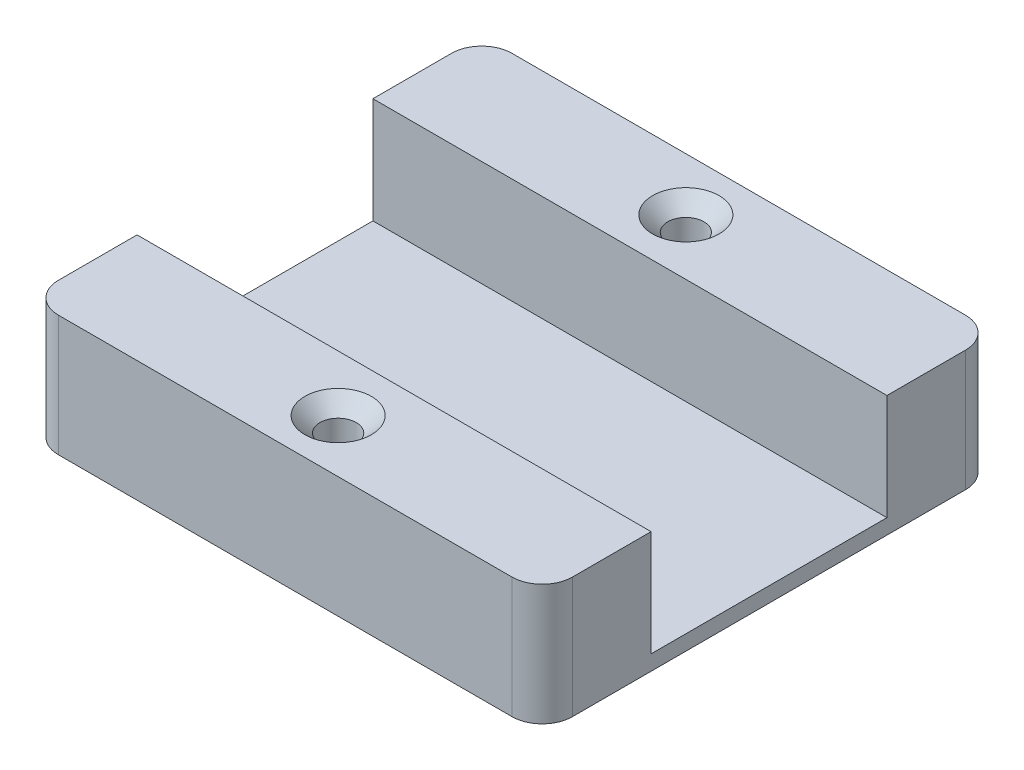
ISO-10303-21;
HEADER;
FILE_DESCRIPTION(('STEP AP214'),'2;1');
FILE_NAME('part.step','',(''),(''),'','','');
FILE_SCHEMA(('AUTOMOTIVE_DESIGN { 1 0 10303 214 1 1 1 1 }'));
ENDSEC;
DATA;
#1=APPLICATION_CONTEXT('core data for automotive mechanical design processes');
#2=APPLICATION_PROTOCOL_DEFINITION('international standard','automotive_design',2000,#1);
#3=PRODUCT_CONTEXT('',#1,'mechanical');
#4=PRODUCT('Part','Part','',(#3));
#5=PRODUCT_RELATED_PRODUCT_CATEGORY('part','',(#4));
#6=PRODUCT_DEFINITION_FORMATION('','',#4);
#7=PRODUCT_DEFINITION_CONTEXT('part definition',#1,'design');
#8=PRODUCT_DEFINITION('design','',#6,#7);
#9=PRODUCT_DEFINITION_SHAPE('','',#8);
#10=(LENGTH_UNIT() NAMED_UNIT(*) SI_UNIT(.MILLI.,.METRE.));
#11=(NAMED_UNIT(*) PLANE_ANGLE_UNIT() SI_UNIT($,.RADIAN.));
#12=(NAMED_UNIT(*) SI_UNIT($,.STERADIAN.) SOLID_ANGLE_UNIT());
#13=UNCERTAINTY_MEASURE_WITH_UNIT(LENGTH_MEASURE(1.E-05),#10,'distance_accuracy_value','');
#14=(GEOMETRIC_REPRESENTATION_CONTEXT(3) GLOBAL_UNCERTAINTY_ASSIGNED_CONTEXT((#13)) GLOBAL_UNIT_ASSIGNED_CONTEXT((#10,
#11,#12)) REPRESENTATION_CONTEXT('',''));
#15=CARTESIAN_POINT('',(0.,0.,0.));
#16=DIRECTION('',(0.,0.,1.));
#17=DIRECTION('',(1.,0.,0.));
#18=AXIS2_PLACEMENT_3D('',#15,#16,#17);
#19=CARTESIAN_POINT('',(0.,8.,0.));
#20=DIRECTION('',(1.,0.,0.));
#21=DIRECTION('',(0.,0.,-1.));
#22=AXIS2_PLACEMENT_3D('',#19,#20,#21);
#23=PLANE('',#22);
#24=DIRECTION('',(0.,0.,1.));
#25=VECTOR('',#24,1.);
#26=CARTESIAN_POINT('',(0.,0.,0.));
#27=LINE('',#26,#25);
#28=CARTESIAN_POINT('',(0.,0.,-28.));
#29=VERTEX_POINT('',#28);
#30=CARTESIAN_POINT('',(0.,0.,-2.));
#31=VERTEX_POINT('',#30);
#32=EDGE_CURVE('E186',#29,#31,#27,.T.);
#33=ORIENTED_EDGE('',*,*,#32,.T.);
#34=DIRECTION('',(0.,-1.,0.));
#35=VECTOR('',#34,1.);
#36=CARTESIAN_POINT('',(0.,8.,-2.));
#37=LINE('',#36,#35);
#38=CARTESIAN_POINT('',(0.,8.,-2.));
#39=VERTEX_POINT('',#38);
#40=EDGE_CURVE('E11',#31,#39,#37,.F.);
#41=ORIENTED_EDGE('',*,*,#40,.T.);
#42=DIRECTION('',(0.,0.,1.));
#43=VECTOR('',#42,1.);
#44=CARTESIAN_POINT('',(0.,8.,0.));
#45=LINE('',#44,#43);
#46=CARTESIAN_POINT('',(0.,8.,-7.2));
#47=VERTEX_POINT('',#46);
#48=EDGE_CURVE('E188',#47,#39,#45,.T.);
#49=ORIENTED_EDGE('',*,*,#48,.F.);
#50=DIRECTION('',(0.,-1.,0.));
#51=VECTOR('',#50,1.);
#52=CARTESIAN_POINT('',(0.,8.,-7.2));
#53=LINE('',#52,#51);
#54=CARTESIAN_POINT('',(0.,0.999999999999999,-7.2));
#55=VERTEX_POINT('',#54);
#56=EDGE_CURVE('E177',#47,#55,#53,.T.);
#57=ORIENTED_EDGE('',*,*,#56,.T.);
#58=DIRECTION('',(0.,0.,-1.));
#59=VECTOR('',#58,1.);
#60=CARTESIAN_POINT('',(0.,1.,-15.));
#61=LINE('',#60,#59);
#62=CARTESIAN_POINT('',(0.,0.999999999999999,-22.8));
#63=VERTEX_POINT('',#62);
#64=EDGE_CURVE('E182',#55,#63,#61,.T.);
#65=ORIENTED_EDGE('',*,*,#64,.T.);
#66=DIRECTION('',(0.,-1.,0.));
#67=VECTOR('',#66,1.);
#68=CARTESIAN_POINT('',(0.,8.,-22.8));
#69=LINE('',#68,#67);
#70=CARTESIAN_POINT('',(0.,8.,-22.8));
#71=VERTEX_POINT('',#70);
#72=EDGE_CURVE('E151',#71,#63,#69,.T.);
#73=ORIENTED_EDGE('',*,*,#72,.F.);
#74=DIRECTION('',(0.,0.,-1.));
#75=VECTOR('',#74,1.);
#76=CARTESIAN_POINT('',(0.,8.,-30.));
#77=LINE('',#76,#75);
#78=CARTESIAN_POINT('',(0.,8.,-28.));
#79=VERTEX_POINT('',#78);
#80=EDGE_CURVE('E162',#71,#79,#77,.T.);
#81=ORIENTED_EDGE('',*,*,#80,.T.);
#82=DIRECTION('',(0.,-1.,0.));
#83=VECTOR('',#82,1.);
#84=CARTESIAN_POINT('',(0.,8.,-28.));
#85=LINE('',#84,#83);
#86=EDGE_CURVE('E45',#79,#29,#85,.T.);
#87=ORIENTED_EDGE('',*,*,#86,.T.);
#88=EDGE_LOOP('',(#33,#41,#49,#57,#65,#73,#81,#87));
#89=FACE_BOUND('',#88,.T.);
#90=ADVANCED_FACE('F37',(#89),#23,.F.);
#91=CARTESIAN_POINT('',(0.,8.,0.));
#92=DIRECTION('',(0.,0.,-1.));
#93=DIRECTION('',(-1.,0.,0.));
#94=AXIS2_PLACEMENT_3D('',#91,#92,#93);
#95=PLANE('',#94);
#96=DIRECTION('',(1.,0.,0.));
#97=VECTOR('',#96,1.);
#98=CARTESIAN_POINT('',(0.,0.,0.));
#99=LINE('',#98,#97);
#100=CARTESIAN_POINT('',(2.,0.,0.));
#101=VERTEX_POINT('',#100);
#102=CARTESIAN_POINT('',(32.,0.,0.));
#103=VERTEX_POINT('',#102);
#104=EDGE_CURVE('E198',#101,#103,#99,.T.);
#105=ORIENTED_EDGE('',*,*,#104,.T.);
#106=DIRECTION('',(0.,-1.,0.));
#107=VECTOR('',#106,1.);
#108=CARTESIAN_POINT('',(32.,8.,0.));
#109=LINE('',#108,#107);
#110=CARTESIAN_POINT('',(32.,8.,0.));
#111=VERTEX_POINT('',#110);
#112=EDGE_CURVE('E224',#103,#111,#109,.F.);
#113=ORIENTED_EDGE('',*,*,#112,.T.);
#114=DIRECTION('',(1.,0.,0.));
#115=VECTOR('',#114,1.);
#116=CARTESIAN_POINT('',(0.,8.,0.));
#117=LINE('',#116,#115);
#118=CARTESIAN_POINT('',(2.,8.,0.));
#119=VERTEX_POINT('',#118);
#120=EDGE_CURVE('E191',#119,#111,#117,.T.);
#121=ORIENTED_EDGE('',*,*,#120,.F.);
#122=DIRECTION('',(0.,-1.,0.));
#123=VECTOR('',#122,1.);
#124=CARTESIAN_POINT('',(2.,8.,0.));
#125=LINE('',#124,#123);
#126=EDGE_CURVE('E221',#119,#101,#125,.T.);
#127=ORIENTED_EDGE('',*,*,#126,.T.);
#128=EDGE_LOOP('',(#105,#113,#121,#127));
#129=FACE_BOUND('',#128,.T.);
#130=ADVANCED_FACE('F253',(#129),#95,.F.);
#131=CARTESIAN_POINT('',(17.,8.,-3.5));
#132=DIRECTION('',(0.,-1.,0.));
#133=DIRECTION('',(0.,0.,-1.));
#134=AXIS2_PLACEMENT_3D('',#131,#132,#133);
#135=CYLINDRICAL_SURFACE('',#134,1.2);
#136=CARTESIAN_POINT('',(17.,0.,-3.5));
#137=DIRECTION('',(0.,-1.,0.));
#138=DIRECTION('',(0.,0.,1.));
#139=AXIS2_PLACEMENT_3D('',#136,#137,#138);
#140=CIRCLE('',#139,1.2);
#141=CARTESIAN_POINT('',(17.,0.,-2.3));
#142=VERTEX_POINT('',#141);
#143=EDGE_CURVE('E192',#142,#142,#140,.T.);
#144=ORIENTED_EDGE('',*,*,#143,.T.);
#145=EDGE_LOOP('',(#144));
#146=FACE_BOUND('',#145,.T.);
#147=CARTESIAN_POINT('',(17.,6.99999999999999,-3.5));
#148=DIRECTION('',(0.,1.,0.));
#149=DIRECTION('',(0.,0.,1.));
#150=AXIS2_PLACEMENT_3D('',#147,#148,#149);
#151=CIRCLE('',#150,1.2);
#152=CARTESIAN_POINT('',(17.,6.99999999999999,-2.3));
#153=VERTEX_POINT('',#152);
#154=EDGE_CURVE('E205',#153,#153,#151,.T.);
#155=ORIENTED_EDGE('',*,*,#154,.T.);
#156=EDGE_LOOP('',(#155));
#157=FACE_BOUND('',#156,.T.);
#158=ADVANCED_FACE('F281',(#146,#157),#135,.F.);
#159=CARTESIAN_POINT('',(17.,8.,-3.5));
#160=DIRECTION('',(0.,1.,0.));
#161=DIRECTION('',(0.,0.,1.));
#162=AXIS2_PLACEMENT_3D('',#159,#160,#161);
#163=PLANE('',#162);
#164=CARTESIAN_POINT('',(17.,8.,-3.5));
#165=DIRECTION('',(0.,1.,0.));
#166=DIRECTION('',(0.,0.,1.));
#167=AXIS2_PLACEMENT_3D('',#164,#165,#166);
#168=CIRCLE('',#167,2.2);
#169=CARTESIAN_POINT('',(17.,8.,-1.3));
#170=VERTEX_POINT('',#169);
#171=EDGE_CURVE('E195',#170,#170,#168,.F.);
#172=ORIENTED_EDGE('',*,*,#171,.T.);
#173=EDGE_LOOP('',(#172));
#174=FACE_BOUND('',#173,.T.);
#175=ORIENTED_EDGE('',*,*,#120,.T.);
#176=CARTESIAN_POINT('',(32.,8.,-2.));
#177=DIRECTION('',(0.,1.,0.));
#178=DIRECTION('',(0.,0.,1.));
#179=AXIS2_PLACEMENT_3D('',#176,#177,#178);
#180=CIRCLE('',#179,2.);
#181=CARTESIAN_POINT('',(34.,8.,-2.));
#182=VERTEX_POINT('',#181);
#183=EDGE_CURVE('E228',#111,#182,#180,.T.);
#184=ORIENTED_EDGE('',*,*,#183,.T.);
#185=DIRECTION('',(0.,0.,1.));
#186=VECTOR('',#185,1.);
#187=CARTESIAN_POINT('',(34.,8.,0.));
#188=LINE('',#187,#186);
#189=CARTESIAN_POINT('',(34.,8.,-7.2));
#190=VERTEX_POINT('',#189);
#191=EDGE_CURVE('E175',#190,#182,#188,.T.);
#192=ORIENTED_EDGE('',*,*,#191,.F.);
#193=DIRECTION('',(1.,0.,0.));
#194=VECTOR('',#193,1.);
#195=CARTESIAN_POINT('',(0.,8.,-7.2));
#196=LINE('',#195,#194);
#197=EDGE_CURVE('E184',#47,#190,#196,.T.);
#198=ORIENTED_EDGE('',*,*,#197,.F.);
#199=ORIENTED_EDGE('',*,*,#48,.T.);
#200=CARTESIAN_POINT('',(2.,8.,-2.));
#201=DIRECTION('',(0.,1.,0.));
#202=DIRECTION('',(0.,0.,1.));
#203=AXIS2_PLACEMENT_3D('',#200,#201,#202);
#204=CIRCLE('',#203,2.);
#205=EDGE_CURVE('E226',#39,#119,#204,.T.);
#206=ORIENTED_EDGE('',*,*,#205,.T.);
#207=EDGE_LOOP('',(#175,#184,#192,#198,#199,#206));
#208=FACE_BOUND('',#207,.T.);
#209=ADVANCED_FACE('F257',(#174,#208),#163,.T.);
#210=CARTESIAN_POINT('',(17.,0.,-3.5));
#211=DIRECTION('',(0.,1.,0.));
#212=DIRECTION('',(0.,0.,1.));
#213=AXIS2_PLACEMENT_3D('',#210,#211,#212);
#214=PLANE('',#213);
#215=ORIENTED_EDGE('',*,*,#143,.F.);
#216=EDGE_LOOP('',(#215));
#217=FACE_BOUND('',#216,.T.);
#218=DIRECTION('',(0.,0.,1.));
#219=VECTOR('',#218,1.);
#220=CARTESIAN_POINT('',(34.,0.,0.));
#221=LINE('',#220,#219);
#222=CARTESIAN_POINT('',(34.,0.,-28.));
#223=VERTEX_POINT('',#222);
#224=CARTESIAN_POINT('',(34.,0.,-2.));
#225=VERTEX_POINT('',#224);
#226=EDGE_CURVE('E138',#223,#225,#221,.T.);
#227=ORIENTED_EDGE('',*,*,#226,.T.);
#228=CARTESIAN_POINT('',(32.,0.,-2.));
#229=DIRECTION('',(0.,1.,0.));
#230=DIRECTION('',(0.,0.,1.));
#231=AXIS2_PLACEMENT_3D('',#228,#229,#230);
#232=CIRCLE('',#231,2.);
#233=EDGE_CURVE('E219',#225,#103,#232,.F.);
#234=ORIENTED_EDGE('',*,*,#233,.T.);
#235=ORIENTED_EDGE('',*,*,#104,.F.);
#236=CARTESIAN_POINT('',(2.,0.,-2.));
#237=DIRECTION('',(0.,1.,0.));
#238=DIRECTION('',(0.,0.,1.));
#239=AXIS2_PLACEMENT_3D('',#236,#237,#238);
#240=CIRCLE('',#239,2.);
#241=EDGE_CURVE('E215',#101,#31,#240,.F.);
#242=ORIENTED_EDGE('',*,*,#241,.T.);
#243=ORIENTED_EDGE('',*,*,#32,.F.);
#244=CARTESIAN_POINT('',(2.,0.,-28.));
#245=DIRECTION('',(0.,1.,0.));
#246=DIRECTION('',(0.,0.,1.));
#247=AXIS2_PLACEMENT_3D('',#244,#245,#246);
#248=CIRCLE('',#247,2.);
#249=CARTESIAN_POINT('',(2.,0.,-30.));
#250=VERTEX_POINT('',#249);
#251=EDGE_CURVE('E213',#29,#250,#248,.F.);
#252=ORIENTED_EDGE('',*,*,#251,.T.);
#253=DIRECTION('',(1.,0.,0.));
#254=VECTOR('',#253,1.);
#255=CARTESIAN_POINT('',(0.,0.,-30.));
#256=LINE('',#255,#254);
#257=CARTESIAN_POINT('',(32.,0.,-30.));
#258=VERTEX_POINT('',#257);
#259=EDGE_CURVE('E152',#250,#258,#256,.T.);
#260=ORIENTED_EDGE('',*,*,#259,.T.);
#261=CARTESIAN_POINT('',(32.,0.,-28.));
#262=DIRECTION('',(0.,1.,0.));
#263=DIRECTION('',(0.,0.,1.));
#264=AXIS2_PLACEMENT_3D('',#261,#262,#263);
#265=CIRCLE('',#264,2.);
#266=EDGE_CURVE('E217',#258,#223,#265,.F.);
#267=ORIENTED_EDGE('',*,*,#266,.T.);
#268=EDGE_LOOP('',(#227,#234,#235,#242,#243,#252,#260,#267));
#269=FACE_BOUND('',#268,.T.);
#270=CARTESIAN_POINT('',(17.,0.,-26.5));
#271=DIRECTION('',(0.,1.,0.));
#272=DIRECTION('',(0.,0.,-1.));
#273=AXIS2_PLACEMENT_3D('',#270,#271,#272);
#274=CIRCLE('',#273,1.2);
#275=CARTESIAN_POINT('',(17.,0.,-27.7));
#276=VERTEX_POINT('',#275);
#277=EDGE_CURVE('E156',#276,#276,#274,.T.);
#278=ORIENTED_EDGE('',*,*,#277,.T.);
#279=EDGE_LOOP('',(#278));
#280=FACE_BOUND('',#279,.T.);
#281=ADVANCED_FACE('F243',(#217,#269,#280),#214,.F.);
#282=CARTESIAN_POINT('',(0.,1.,-15.));
#283=DIRECTION('',(0.,-1.,0.));
#284=DIRECTION('',(0.,0.,-1.));
#285=AXIS2_PLACEMENT_3D('',#282,#283,#284);
#286=PLANE('',#285);
#287=DIRECTION('',(1.,0.,0.));
#288=VECTOR('',#287,1.);
#289=CARTESIAN_POINT('',(0.,0.999999999999999,-7.2));
#290=LINE('',#289,#288);
#291=CARTESIAN_POINT('',(34.,0.999999999999999,-7.2));
#292=VERTEX_POINT('',#291);
#293=EDGE_CURVE('E134',#55,#292,#290,.T.);
#294=ORIENTED_EDGE('',*,*,#293,.T.);
#295=DIRECTION('',(0.,0.,-1.));
#296=VECTOR('',#295,1.);
#297=CARTESIAN_POINT('',(34.,1.,-15.));
#298=LINE('',#297,#296);
#299=CARTESIAN_POINT('',(34.,0.999999999999999,-22.8));
#300=VERTEX_POINT('',#299);
#301=EDGE_CURVE('E127',#292,#300,#298,.T.);
#302=ORIENTED_EDGE('',*,*,#301,.T.);
#303=DIRECTION('',(1.,0.,0.));
#304=VECTOR('',#303,1.);
#305=CARTESIAN_POINT('',(0.,0.999999999999999,-22.8));
#306=LINE('',#305,#304);
#307=EDGE_CURVE('E132',#63,#300,#306,.T.);
#308=ORIENTED_EDGE('',*,*,#307,.F.);
#309=ORIENTED_EDGE('',*,*,#64,.F.);
#310=EDGE_LOOP('',(#294,#302,#308,#309));
#311=FACE_BOUND('',#310,.T.);
#312=ADVANCED_FACE('F129',(#311),#286,.F.);
#313=CARTESIAN_POINT('',(0.,8.,-7.2));
#314=DIRECTION('',(0.,0.,1.));
#315=DIRECTION('',(0.,-1.,0.));
#316=AXIS2_PLACEMENT_3D('',#313,#314,#315);
#317=PLANE('',#316);
#318=ORIENTED_EDGE('',*,*,#197,.T.);
#319=DIRECTION('',(0.,-1.,0.));
#320=VECTOR('',#319,1.);
#321=CARTESIAN_POINT('',(34.,8.,-7.2));
#322=LINE('',#321,#320);
#323=EDGE_CURVE('E139',#190,#292,#322,.T.);
#324=ORIENTED_EDGE('',*,*,#323,.T.);
#325=ORIENTED_EDGE('',*,*,#293,.F.);
#326=ORIENTED_EDGE('',*,*,#56,.F.);
#327=EDGE_LOOP('',(#318,#324,#325,#326));
#328=FACE_BOUND('',#327,.T.);
#329=ADVANCED_FACE('F288',(#328),#317,.F.);
#330=CARTESIAN_POINT('',(17.,8.,-3.5));
#331=DIRECTION('',(0.,1.,0.));
#332=DIRECTION('',(0.,0.,1.));
#333=AXIS2_PLACEMENT_3D('',#330,#331,#332);
#334=CONICAL_SURFACE('',#333,2.2,0.785398163397445);
#335=ORIENTED_EDGE('',*,*,#171,.F.);
#336=EDGE_LOOP('',(#335));
#337=FACE_BOUND('',#336,.T.);
#338=ORIENTED_EDGE('',*,*,#154,.F.);
#339=EDGE_LOOP('',(#338));
#340=FACE_BOUND('',#339,.T.);
#341=ADVANCED_FACE('F285',(#337,#340),#334,.F.);
#342=CARTESIAN_POINT('',(34.,8.,0.));
#343=DIRECTION('',(-1.,0.,0.));
#344=DIRECTION('',(0.,0.,-1.));
#345=AXIS2_PLACEMENT_3D('',#342,#343,#344);
#346=PLANE('',#345);
#347=ORIENTED_EDGE('',*,*,#191,.T.);
#348=DIRECTION('',(0.,-1.,0.));
#349=VECTOR('',#348,1.);
#350=CARTESIAN_POINT('',(34.,8.,-2.));
#351=LINE('',#350,#349);
#352=EDGE_CURVE('E210',#182,#225,#351,.T.);
#353=ORIENTED_EDGE('',*,*,#352,.T.);
#354=ORIENTED_EDGE('',*,*,#226,.F.);
#355=DIRECTION('',(0.,-1.,0.));
#356=VECTOR('',#355,1.);
#357=CARTESIAN_POINT('',(34.,8.,-28.));
#358=LINE('',#357,#356);
#359=CARTESIAN_POINT('',(34.,8.,-28.));
#360=VERTEX_POINT('',#359);
#361=EDGE_CURVE('E208',#223,#360,#358,.F.);
#362=ORIENTED_EDGE('',*,*,#361,.T.);
#363=DIRECTION('',(0.,0.,-1.));
#364=VECTOR('',#363,1.);
#365=CARTESIAN_POINT('',(34.,8.,-30.));
#366=LINE('',#365,#364);
#367=CARTESIAN_POINT('',(34.,8.,-22.8));
#368=VERTEX_POINT('',#367);
#369=EDGE_CURVE('E145',#368,#360,#366,.T.);
#370=ORIENTED_EDGE('',*,*,#369,.F.);
#371=DIRECTION('',(0.,-1.,0.));
#372=VECTOR('',#371,1.);
#373=CARTESIAN_POINT('',(34.,8.,-22.8));
#374=LINE('',#373,#372);
#375=EDGE_CURVE('E142',#368,#300,#374,.T.);
#376=ORIENTED_EDGE('',*,*,#375,.T.);
#377=ORIENTED_EDGE('',*,*,#301,.F.);
#378=ORIENTED_EDGE('',*,*,#323,.F.);
#379=EDGE_LOOP('',(#347,#353,#354,#362,#370,#376,#377,#378));
#380=FACE_BOUND('',#379,.T.);
#381=ADVANCED_FACE('F144',(#380),#346,.F.);
#382=CARTESIAN_POINT('',(0.,8.,-30.));
#383=DIRECTION('',(0.,0.,1.));
#384=DIRECTION('',(-1.,0.,0.));
#385=AXIS2_PLACEMENT_3D('',#382,#383,#384);
#386=PLANE('',#385);
#387=DIRECTION('',(1.,0.,0.));
#388=VECTOR('',#387,1.);
#389=CARTESIAN_POINT('',(0.,8.,-30.));
#390=LINE('',#389,#388);
#391=CARTESIAN_POINT('',(2.,8.,-30.));
#392=VERTEX_POINT('',#391);
#393=CARTESIAN_POINT('',(32.,8.,-30.));
#394=VERTEX_POINT('',#393);
#395=EDGE_CURVE('E164',#392,#394,#390,.T.);
#396=ORIENTED_EDGE('',*,*,#395,.T.);
#397=DIRECTION('',(0.,-1.,0.));
#398=VECTOR('',#397,1.);
#399=CARTESIAN_POINT('',(32.,8.,-30.));
#400=LINE('',#399,#398);
#401=EDGE_CURVE('E232',#394,#258,#400,.T.);
#402=ORIENTED_EDGE('',*,*,#401,.T.);
#403=ORIENTED_EDGE('',*,*,#259,.F.);
#404=DIRECTION('',(0.,-1.,0.));
#405=VECTOR('',#404,1.);
#406=CARTESIAN_POINT('',(2.,8.,-30.));
#407=LINE('',#406,#405);
#408=EDGE_CURVE('E230',#250,#392,#407,.F.);
#409=ORIENTED_EDGE('',*,*,#408,.T.);
#410=EDGE_LOOP('',(#396,#402,#403,#409));
#411=FACE_BOUND('',#410,.T.);
#412=ADVANCED_FACE('F268',(#411),#386,.F.);
#413=CARTESIAN_POINT('',(17.,8.,-26.5));
#414=DIRECTION('',(0.,-1.,0.));
#415=DIRECTION('',(0.,0.,1.));
#416=AXIS2_PLACEMENT_3D('',#413,#414,#415);
#417=CYLINDRICAL_SURFACE('',#416,1.2);
#418=ORIENTED_EDGE('',*,*,#277,.F.);
#419=EDGE_LOOP('',(#418));
#420=FACE_BOUND('',#419,.T.);
#421=CARTESIAN_POINT('',(17.,6.99999999999999,-26.5));
#422=DIRECTION('',(0.,-1.,0.));
#423=DIRECTION('',(0.,0.,-1.));
#424=AXIS2_PLACEMENT_3D('',#421,#422,#423);
#425=CIRCLE('',#424,1.2);
#426=CARTESIAN_POINT('',(17.,6.99999999999999,-27.7));
#427=VERTEX_POINT('',#426);
#428=EDGE_CURVE('E171',#427,#427,#425,.T.);
#429=ORIENTED_EDGE('',*,*,#428,.F.);
#430=EDGE_LOOP('',(#429));
#431=FACE_BOUND('',#430,.T.);
#432=ADVANCED_FACE('F339',(#420,#431),#417,.F.);
#433=CARTESIAN_POINT('',(17.,8.,-26.5));
#434=DIRECTION('',(0.,1.,0.));
#435=DIRECTION('',(0.,0.,-1.));
#436=AXIS2_PLACEMENT_3D('',#433,#434,#435);
#437=PLANE('',#436);
#438=CARTESIAN_POINT('',(17.,8.,-26.5));
#439=DIRECTION('',(0.,-1.,0.));
#440=DIRECTION('',(0.,0.,-1.));
#441=AXIS2_PLACEMENT_3D('',#438,#439,#440);
#442=CIRCLE('',#441,2.2);
#443=CARTESIAN_POINT('',(17.,8.,-28.7));
#444=VERTEX_POINT('',#443);
#445=EDGE_CURVE('E165',#444,#444,#442,.F.);
#446=ORIENTED_EDGE('',*,*,#445,.F.);
#447=EDGE_LOOP('',(#446));
#448=FACE_BOUND('',#447,.T.);
#449=ORIENTED_EDGE('',*,*,#369,.T.);
#450=CARTESIAN_POINT('',(32.,8.,-28.));
#451=DIRECTION('',(0.,1.,0.));
#452=DIRECTION('',(0.,0.,1.));
#453=AXIS2_PLACEMENT_3D('',#450,#451,#452);
#454=CIRCLE('',#453,2.);
#455=EDGE_CURVE('E58',#360,#394,#454,.T.);
#456=ORIENTED_EDGE('',*,*,#455,.T.);
#457=ORIENTED_EDGE('',*,*,#395,.F.);
#458=CARTESIAN_POINT('',(2.,8.,-28.));
#459=DIRECTION('',(0.,1.,0.));
#460=DIRECTION('',(0.,0.,1.));
#461=AXIS2_PLACEMENT_3D('',#458,#459,#460);
#462=CIRCLE('',#461,2.);
#463=EDGE_CURVE('E52',#392,#79,#462,.T.);
#464=ORIENTED_EDGE('',*,*,#463,.T.);
#465=ORIENTED_EDGE('',*,*,#80,.F.);
#466=DIRECTION('',(1.,0.,0.));
#467=VECTOR('',#466,1.);
#468=CARTESIAN_POINT('',(0.,8.,-22.8));
#469=LINE('',#468,#467);
#470=EDGE_CURVE('E153',#71,#368,#469,.T.);
#471=ORIENTED_EDGE('',*,*,#470,.T.);
#472=EDGE_LOOP('',(#449,#456,#457,#464,#465,#471));
#473=FACE_BOUND('',#472,.T.);
#474=ADVANCED_FACE('F270',(#448,#473),#437,.T.);
#475=CARTESIAN_POINT('',(0.,8.,-22.8));
#476=DIRECTION('',(0.,0.,-1.));
#477=DIRECTION('',(0.,-1.,0.));
#478=AXIS2_PLACEMENT_3D('',#475,#476,#477);
#479=PLANE('',#478);
#480=ORIENTED_EDGE('',*,*,#470,.F.);
#481=ORIENTED_EDGE('',*,*,#72,.T.);
#482=ORIENTED_EDGE('',*,*,#307,.T.);
#483=ORIENTED_EDGE('',*,*,#375,.F.);
#484=EDGE_LOOP('',(#480,#481,#482,#483));
#485=FACE_BOUND('',#484,.T.);
#486=ADVANCED_FACE('F149',(#485),#479,.F.);
#487=CARTESIAN_POINT('',(17.,8.,-26.5));
#488=DIRECTION('',(0.,1.,0.));
#489=DIRECTION('',(0.,0.,-1.));
#490=AXIS2_PLACEMENT_3D('',#487,#488,#489);
#491=CONICAL_SURFACE('',#490,2.2,0.785398163397445);
#492=ORIENTED_EDGE('',*,*,#445,.T.);
#493=EDGE_LOOP('',(#492));
#494=FACE_BOUND('',#493,.T.);
#495=ORIENTED_EDGE('',*,*,#428,.T.);
#496=EDGE_LOOP('',(#495));
#497=FACE_BOUND('',#496,.T.);
#498=ADVANCED_FACE('F292',(#494,#497),#491,.F.);
#499=CARTESIAN_POINT('',(32.,8.,-2.));
#500=DIRECTION('',(0.,-1.,0.));
#501=DIRECTION('',(0.,0.,-1.));
#502=AXIS2_PLACEMENT_3D('',#499,#500,#501);
#503=CYLINDRICAL_SURFACE('',#502,2.);
#504=ORIENTED_EDGE('',*,*,#183,.F.);
#505=ORIENTED_EDGE('',*,*,#112,.F.);
#506=ORIENTED_EDGE('',*,*,#233,.F.);
#507=ORIENTED_EDGE('',*,*,#352,.F.);
#508=EDGE_LOOP('',(#504,#505,#506,#507));
#509=FACE_BOUND('',#508,.T.);
#510=ADVANCED_FACE('F261',(#509),#503,.T.);
#511=CARTESIAN_POINT('',(32.,8.,-28.));
#512=DIRECTION('',(0.,-1.,0.));
#513=DIRECTION('',(0.,0.,-1.));
#514=AXIS2_PLACEMENT_3D('',#511,#512,#513);
#515=CYLINDRICAL_SURFACE('',#514,2.);
#516=ORIENTED_EDGE('',*,*,#455,.F.);
#517=ORIENTED_EDGE('',*,*,#361,.F.);
#518=ORIENTED_EDGE('',*,*,#266,.F.);
#519=ORIENTED_EDGE('',*,*,#401,.F.);
#520=EDGE_LOOP('',(#516,#517,#518,#519));
#521=FACE_BOUND('',#520,.T.);
#522=ADVANCED_FACE('F266',(#521),#515,.T.);
#523=CARTESIAN_POINT('',(2.,8.,-2.));
#524=DIRECTION('',(0.,-1.,0.));
#525=DIRECTION('',(0.,0.,-1.));
#526=AXIS2_PLACEMENT_3D('',#523,#524,#525);
#527=CYLINDRICAL_SURFACE('',#526,2.);
#528=ORIENTED_EDGE('',*,*,#205,.F.);
#529=ORIENTED_EDGE('',*,*,#40,.F.);
#530=ORIENTED_EDGE('',*,*,#241,.F.);
#531=ORIENTED_EDGE('',*,*,#126,.F.);
#532=EDGE_LOOP('',(#528,#529,#530,#531));
#533=FACE_BOUND('',#532,.T.);
#534=ADVANCED_FACE('F250',(#533),#527,.T.);
#535=CARTESIAN_POINT('',(2.,8.,-28.));
#536=DIRECTION('',(0.,-1.,0.));
#537=DIRECTION('',(0.,0.,-1.));
#538=AXIS2_PLACEMENT_3D('',#535,#536,#537);
#539=CYLINDRICAL_SURFACE('',#538,2.);
#540=ORIENTED_EDGE('',*,*,#463,.F.);
#541=ORIENTED_EDGE('',*,*,#408,.F.);
#542=ORIENTED_EDGE('',*,*,#251,.F.);
#543=ORIENTED_EDGE('',*,*,#86,.F.);
#544=EDGE_LOOP('',(#540,#541,#542,#543));
#545=FACE_BOUND('',#544,.T.);
#546=ADVANCED_FACE('F39',(#545),#539,.T.);
#547=CLOSED_SHELL('',(#90,#130,#158,#209,#281,#312,#329,#341,#381,#412,#432,#474,#486,#498,#510,
#522,#534,#546));
#548=MANIFOLD_SOLID_BREP('B2',#547);
#549=ADVANCED_BREP_SHAPE_REPRESENTATION('',(#18,#548),#14);
#550=SHAPE_DEFINITION_REPRESENTATION(#9,#549);
ENDSEC;
END-ISO-10303-21;
